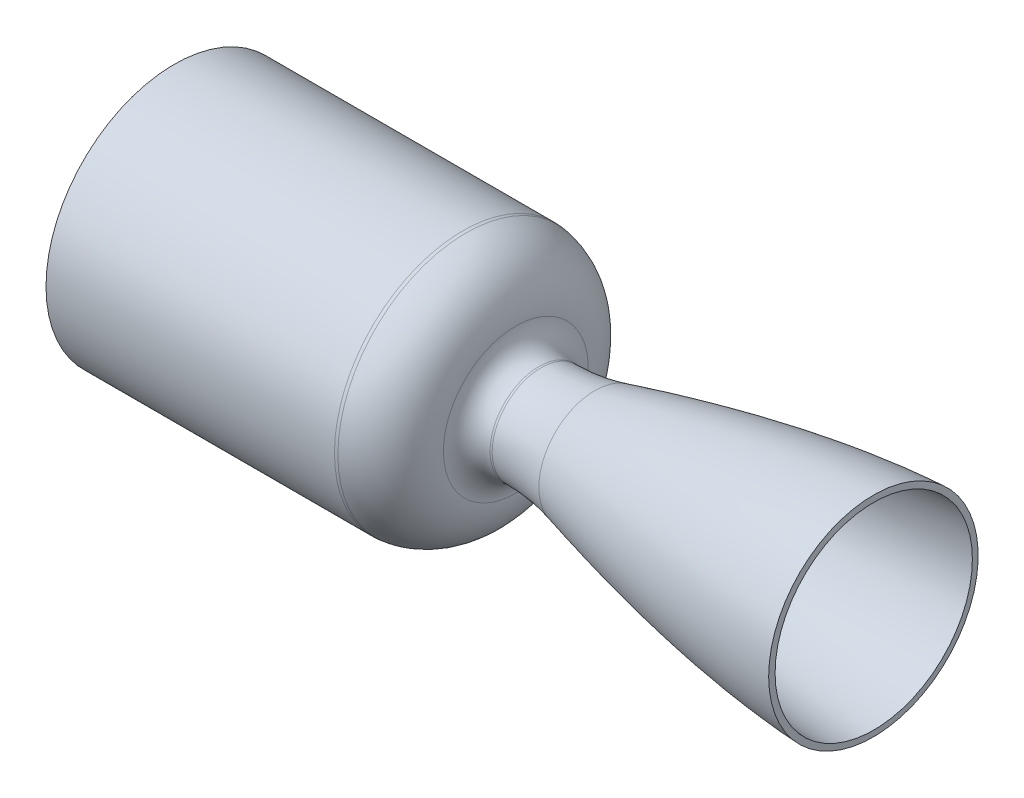
ISO-10303-21;
HEADER;
FILE_DESCRIPTION(('STEP AP214'),'2;1');
FILE_NAME('part.step','',(''),(''),'','','');
FILE_SCHEMA(('AUTOMOTIVE_DESIGN { 1 0 10303 214 1 1 1 1 }'));
ENDSEC;
DATA;
#1=APPLICATION_CONTEXT('core data for automotive mechanical design processes');
#2=APPLICATION_PROTOCOL_DEFINITION('international standard','automotive_design',2000,#1);
#3=PRODUCT_CONTEXT('',#1,'mechanical');
#4=PRODUCT('Part','Part','',(#3));
#5=PRODUCT_RELATED_PRODUCT_CATEGORY('part','',(#4));
#6=PRODUCT_DEFINITION_FORMATION('','',#4);
#7=PRODUCT_DEFINITION_CONTEXT('part definition',#1,'design');
#8=PRODUCT_DEFINITION('design','',#6,#7);
#9=PRODUCT_DEFINITION_SHAPE('','',#8);
#10=(LENGTH_UNIT() NAMED_UNIT(*) SI_UNIT(.MILLI.,.METRE.));
#11=(NAMED_UNIT(*) PLANE_ANGLE_UNIT() SI_UNIT($,.RADIAN.));
#12=(NAMED_UNIT(*) SI_UNIT($,.STERADIAN.) SOLID_ANGLE_UNIT());
#13=UNCERTAINTY_MEASURE_WITH_UNIT(LENGTH_MEASURE(1.E-05),#10,'distance_accuracy_value','');
#14=(GEOMETRIC_REPRESENTATION_CONTEXT(3) GLOBAL_UNCERTAINTY_ASSIGNED_CONTEXT((#13)) GLOBAL_UNIT_ASSIGNED_CONTEXT((#10,
#11,#12)) REPRESENTATION_CONTEXT('',''));
#15=CARTESIAN_POINT('',(0.,0.,0.));
#16=DIRECTION('',(0.,0.,1.));
#17=DIRECTION('',(1.,0.,0.));
#18=AXIS2_PLACEMENT_3D('',#15,#16,#17);
#19=CARTESIAN_POINT('',(-739471.560983386,-672865.723159545,0.));
#20=CARTESIAN_POINT('',(730979.861955402,682847.713899087,0.));
#21=CARTESIAN_POINT('',(-720830.549221071,-692809.525620858,0.));
#22=B_SPLINE_CURVE_WITH_KNOTS('',2,(#19,#20,#21),.UNSPECIFIED.,.F.,.F.,(3,3),(0.,1.),.UNSPECIFIED.);
#23=CARTESIAN_POINT('',(0.,0.,0.));
#24=DIRECTION('',(-1.,0.,0.));
#25=AXIS1_PLACEMENT('',#23,#24);
#26=SURFACE_OF_REVOLUTION('',#22,#25);
#27=CARTESIAN_POINT('',(290.67000002701,0.,0.));
#28=DIRECTION('',(-1.,0.,0.));
#29=DIRECTION('',(0.,0.,1.));
#30=AXIS2_PLACEMENT_3D('',#27,#28,#29);
#31=CIRCLE('',#30,41.0000000013681);
#32=CARTESIAN_POINT('',(290.67000002701,0.,41.0000000013681));
#33=VERTEX_POINT('',#32);
#34=EDGE_CURVE('E73',#33,#33,#31,.T.);
#35=ORIENTED_EDGE('',*,*,#34,.F.);
#36=EDGE_LOOP('',(#35));
#37=FACE_BOUND('',#36,.T.);
#38=CARTESIAN_POINT('',(175.409013109655,0.,0.));
#39=DIRECTION('',(-1.,0.,0.));
#40=DIRECTION('',(0.,0.,1.));
#41=AXIS2_PLACEMENT_3D('',#38,#39,#40);
#42=CIRCLE('',#41,20.8091940429087);
#43=CARTESIAN_POINT('',(175.409013109655,0.,20.8091940429087));
#44=VERTEX_POINT('',#43);
#45=EDGE_CURVE('E94',#44,#44,#42,.T.);
#46=ORIENTED_EDGE('',*,*,#45,.T.);
#47=EDGE_LOOP('',(#46));
#48=FACE_BOUND('',#47,.T.);
#49=ADVANCED_FACE('F41',(#37,#48),#26,.T.);
#50=CARTESIAN_POINT('',(290.537066698398,0.,0.));
#51=DIRECTION('',(-1.,0.,0.));
#52=DIRECTION('',(0.,0.,1.));
#53=AXIS2_PLACEMENT_3D('',#50,#51,#52);
#54=CONICAL_SURFACE('',#53,43.5365190196446,1.51843644933143);
#55=ORIENTED_EDGE('',*,*,#34,.T.);
#56=EDGE_LOOP('',(#55));
#57=FACE_BOUND('',#56,.T.);
#58=CARTESIAN_POINT('',(290.537066698398,0.,0.));
#59=DIRECTION('',(-1.,0.,0.));
#60=DIRECTION('',(0.,0.,1.));
#61=AXIS2_PLACEMENT_3D('',#58,#59,#60);
#62=CIRCLE('',#61,43.5365190196446);
#63=CARTESIAN_POINT('',(290.537066698398,0.,43.5365190196446));
#64=VERTEX_POINT('',#63);
#65=EDGE_CURVE('E76',#64,#64,#62,.T.);
#66=ORIENTED_EDGE('',*,*,#65,.F.);
#67=EDGE_LOOP('',(#66));
#68=FACE_BOUND('',#67,.T.);
#69=ADVANCED_FACE('F113',(#57,#68),#54,.T.);
#70=CARTESIAN_POINT('',(174.75161273509,23.2626456416472,0.));
#71=CARTESIAN_POINT('',(218.642379212097,35.0231410743445,0.));
#72=CARTESIAN_POINT('',(257.222392683807,41.7905709395863,0.));
#73=CARTESIAN_POINT('',(290.537066698398,43.5365190196446,0.));
#74=B_SPLINE_CURVE_WITH_KNOTS('',3,(#70,#71,#72,#73),.UNSPECIFIED.,.F.,.F.,(4,4),(0.,1.),.UNSPECIFIED.);
#75=CARTESIAN_POINT('',(0.,0.,0.));
#76=DIRECTION('',(-1.,0.,0.));
#77=AXIS1_PLACEMENT('',#75,#76);
#78=SURFACE_OF_REVOLUTION('',#74,#77);
#79=ORIENTED_EDGE('',*,*,#65,.T.);
#80=EDGE_LOOP('',(#79));
#81=FACE_BOUND('',#80,.T.);
#82=CARTESIAN_POINT('',(174.751612735093,0.,0.));
#83=DIRECTION('',(-1.,0.,0.));
#84=DIRECTION('',(0.,0.,1.));
#85=AXIS2_PLACEMENT_3D('',#82,#83,#84);
#86=CIRCLE('',#85,23.2626456416826);
#87=CARTESIAN_POINT('',(174.751612735093,0.,23.2626456416826));
#88=VERTEX_POINT('',#87);
#89=EDGE_CURVE('E79',#88,#88,#86,.T.);
#90=ORIENTED_EDGE('',*,*,#89,.F.);
#91=EDGE_LOOP('',(#90));
#92=FACE_BOUND('',#91,.T.);
#93=ADVANCED_FACE('F108',(#81,#92),#78,.F.);
#94=CARTESIAN_POINT('',(152.4,0.,0.));
#95=DIRECTION('',(-1.,0.,0.));
#96=DIRECTION('',(0.,0.,1.));
#97=AXIS2_PLACEMENT_3D('',#94,#95,#96);
#98=TOROIDAL_SURFACE('',#97,106.68,86.3600000000039);
#99=ORIENTED_EDGE('',*,*,#89,.T.);
#100=EDGE_LOOP('',(#99));
#101=FACE_BOUND('',#100,.T.);
#102=CARTESIAN_POINT('',(152.4,0.,0.));
#103=DIRECTION('',(-1.,0.,0.));
#104=DIRECTION('',(0.,0.,1.));
#105=AXIS2_PLACEMENT_3D('',#102,#103,#104);
#106=CIRCLE('',#105,20.3199999999961);
#107=CARTESIAN_POINT('',(152.4,0.,20.3199999999961));
#108=VERTEX_POINT('',#107);
#109=EDGE_CURVE('E82',#108,#108,#106,.T.);
#110=ORIENTED_EDGE('',*,*,#109,.F.);
#111=EDGE_LOOP('',(#110));
#112=FACE_BOUND('',#111,.T.);
#113=ADVANCED_FACE('F112',(#101,#112),#98,.F.);
#114=CARTESIAN_POINT('',(152.4,0.,0.));
#115=DIRECTION('',(-1.,0.,0.));
#116=DIRECTION('',(0.,0.,1.));
#117=AXIS2_PLACEMENT_3D('',#114,#115,#116);
#118=TOROIDAL_SURFACE('',#117,42.67,22.35);
#119=CARTESIAN_POINT('',(151.543239185923,0.,0.));
#120=DIRECTION('',(1.,0.,0.));
#121=DIRECTION('',(0.,0.,-1.));
#122=AXIS2_PLACEMENT_3D('',#119,#120,#121);
#123=CIRCLE('',#122,20.3364274934022);
#124=CARTESIAN_POINT('',(151.543239185923,0.,-20.3364274934022));
#125=VERTEX_POINT('',#124);
#126=EDGE_CURVE('E61',#125,#125,#123,.T.);
#127=ORIENTED_EDGE('',*,*,#126,.T.);
#128=EDGE_LOOP('',(#127));
#129=FACE_BOUND('',#128,.T.);
#130=ORIENTED_EDGE('',*,*,#109,.T.);
#131=EDGE_LOOP('',(#130));
#132=FACE_BOUND('',#131,.T.);
#133=ADVANCED_FACE('F166',(#129,#132),#118,.F.);
#134=CARTESIAN_POINT('',(118.015626081095,0.,0.));
#135=DIRECTION('',(-1.,0.,0.));
#136=DIRECTION('',(0.,0.,1.));
#137=AXIS2_PLACEMENT_3D('',#134,#135,#136);
#138=TOROIDAL_SURFACE('',#137,29.5456340164311,23.92);
#139=CARTESIAN_POINT('',(121.222102393642,0.,0.));
#140=DIRECTION('',(-1.,0.,0.));
#141=DIRECTION('',(0.,0.,1.));
#142=AXIS2_PLACEMENT_3D('',#139,#140,#141);
#143=CIRCLE('',#142,53.2497456778512);
#144=CARTESIAN_POINT('',(121.222102393642,0.,53.2497456778512));
#145=VERTEX_POINT('',#144);
#146=EDGE_CURVE('E64',#145,#145,#143,.F.);
#147=ORIENTED_EDGE('',*,*,#146,.T.);
#148=EDGE_LOOP('',(#147));
#149=FACE_BOUND('',#148,.T.);
#150=CARTESIAN_POINT('',(141.929245023845,0.,0.));
#151=DIRECTION('',(-1.,0.,0.));
#152=DIRECTION('',(0.,0.,1.));
#153=AXIS2_PLACEMENT_3D('',#150,#151,#152);
#154=CIRCLE('',#153,30.0981094104213);
#155=CARTESIAN_POINT('',(141.929245023845,0.,30.0981094104213));
#156=VERTEX_POINT('',#155);
#157=EDGE_CURVE('E67',#156,#156,#154,.T.);
#158=ORIENTED_EDGE('',*,*,#157,.T.);
#159=EDGE_LOOP('',(#158));
#160=FACE_BOUND('',#159,.T.);
#161=ADVANCED_FACE('F163',(#149,#160),#138,.T.);
#162=CARTESIAN_POINT('',(0.,0.,0.));
#163=DIRECTION('',(-1.,0.,0.));
#164=DIRECTION('',(0.,0.,1.));
#165=AXIS2_PLACEMENT_3D('',#162,#163,#164);
#166=CYLINDRICAL_SURFACE('',#165,53.34);
#167=CARTESIAN_POINT('',(119.881602262978,0.,0.));
#168=DIRECTION('',(1.,0.,0.));
#169=DIRECTION('',(0.,0.,-1.));
#170=AXIS2_PLACEMENT_3D('',#167,#168,#169);
#171=CIRCLE('',#170,53.34);
#172=CARTESIAN_POINT('',(119.881602262978,0.,-53.34));
#173=VERTEX_POINT('',#172);
#174=EDGE_CURVE('E70',#173,#173,#171,.F.);
#175=ORIENTED_EDGE('',*,*,#174,.T.);
#176=EDGE_LOOP('',(#175));
#177=FACE_BOUND('',#176,.T.);
#178=CARTESIAN_POINT('',(0.,0.,0.));
#179=DIRECTION('',(-1.,0.,0.));
#180=DIRECTION('',(0.,0.,1.));
#181=AXIS2_PLACEMENT_3D('',#178,#179,#180);
#182=CIRCLE('',#181,53.34);
#183=CARTESIAN_POINT('',(0.,0.,53.34));
#184=VERTEX_POINT('',#183);
#185=EDGE_CURVE('E85',#184,#184,#182,.T.);
#186=ORIENTED_EDGE('',*,*,#185,.F.);
#187=EDGE_LOOP('',(#186));
#188=FACE_BOUND('',#187,.T.);
#189=ADVANCED_FACE('F159',(#177,#188),#166,.T.);
#190=CARTESIAN_POINT('',(0.,50.8,0.));
#191=DIRECTION('',(-1.,0.,0.));
#192=DIRECTION('',(0.,0.,1.));
#193=AXIS2_PLACEMENT_3D('',#190,#191,#192);
#194=PLANE('',#193);
#195=ORIENTED_EDGE('',*,*,#185,.T.);
#196=EDGE_LOOP('',(#195));
#197=FACE_BOUND('',#196,.T.);
#198=CARTESIAN_POINT('',(0.,0.,0.));
#199=DIRECTION('',(-1.,0.,0.));
#200=DIRECTION('',(0.,0.,1.));
#201=AXIS2_PLACEMENT_3D('',#198,#199,#200);
#202=CIRCLE('',#201,50.8);
#203=CARTESIAN_POINT('',(0.,0.,50.8));
#204=VERTEX_POINT('',#203);
#205=EDGE_CURVE('E88',#204,#204,#202,.T.);
#206=ORIENTED_EDGE('',*,*,#205,.F.);
#207=EDGE_LOOP('',(#206));
#208=FACE_BOUND('',#207,.T.);
#209=ADVANCED_FACE('F153',(#197,#208),#194,.T.);
#210=CARTESIAN_POINT('',(0.,0.,0.));
#211=DIRECTION('',(-1.,0.,0.));
#212=DIRECTION('',(0.,0.,1.));
#213=AXIS2_PLACEMENT_3D('',#210,#211,#212);
#214=CYLINDRICAL_SURFACE('',#213,50.8);
#215=CARTESIAN_POINT('',(119.701937531535,0.,0.));
#216=DIRECTION('',(-1.,0.,0.));
#217=DIRECTION('',(0.,0.,1.));
#218=AXIS2_PLACEMENT_3D('',#215,#216,#217);
#219=CIRCLE('',#218,50.8);
#220=CARTESIAN_POINT('',(119.701937531535,0.,50.8));
#221=VERTEX_POINT('',#220);
#222=EDGE_CURVE('E48',#221,#221,#219,.F.);
#223=ORIENTED_EDGE('',*,*,#222,.T.);
#224=EDGE_LOOP('',(#223));
#225=FACE_BOUND('',#224,.T.);
#226=ORIENTED_EDGE('',*,*,#205,.T.);
#227=EDGE_LOOP('',(#226));
#228=FACE_BOUND('',#227,.T.);
#229=ADVANCED_FACE('F145',(#225,#228),#214,.F.);
#230=CARTESIAN_POINT('',(118.015626081095,0.,0.));
#231=DIRECTION('',(-1.,0.,0.));
#232=DIRECTION('',(0.,0.,1.));
#233=AXIS2_PLACEMENT_3D('',#230,#231,#232);
#234=TOROIDAL_SURFACE('',#233,29.5456340164311,21.38);
#235=CARTESIAN_POINT('',(121.183757786756,0.,0.));
#236=DIRECTION('',(-1.,0.,0.));
#237=DIRECTION('',(0.,0.,1.));
#238=AXIS2_PLACEMENT_3D('',#235,#236,#237);
#239=CIRCLE('',#238,50.6896010400429);
#240=CARTESIAN_POINT('',(121.183757786756,0.,50.6896010400429));
#241=VERTEX_POINT('',#240);
#242=EDGE_CURVE('E52',#241,#241,#239,.T.);
#243=ORIENTED_EDGE('',*,*,#242,.T.);
#244=EDGE_LOOP('',(#243));
#245=FACE_BOUND('',#244,.T.);
#246=CARTESIAN_POINT('',(139.372712772034,0.,0.));
#247=DIRECTION('',(-1.,0.,0.));
#248=DIRECTION('',(0.,0.,1.));
#249=AXIS2_PLACEMENT_3D('',#246,#247,#248);
#250=CIRCLE('',#249,28.5560643747716);
#251=CARTESIAN_POINT('',(139.372712772034,0.,28.5560643747716));
#252=VERTEX_POINT('',#251);
#253=EDGE_CURVE('E56',#252,#252,#250,.F.);
#254=ORIENTED_EDGE('',*,*,#253,.T.);
#255=EDGE_LOOP('',(#254));
#256=FACE_BOUND('',#255,.T.);
#257=ADVANCED_FACE('F141',(#245,#256),#234,.F.);
#258=CARTESIAN_POINT('',(152.4,0.,0.));
#259=DIRECTION('',(-1.,0.,0.));
#260=DIRECTION('',(0.,0.,1.));
#261=AXIS2_PLACEMENT_3D('',#258,#259,#260);
#262=TOROIDAL_SURFACE('',#261,42.67,24.89);
#263=CARTESIAN_POINT('',(147.321697148373,0.,0.));
#264=DIRECTION('',(1.,0.,0.));
#265=DIRECTION('',(0.,0.,-1.));
#266=AXIS2_PLACEMENT_3D('',#263,#264,#265);
#267=CIRCLE('',#266,18.3035694007686);
#268=CARTESIAN_POINT('',(147.321697148373,0.,-18.3035694007686));
#269=VERTEX_POINT('',#268);
#270=EDGE_CURVE('E10',#269,#269,#267,.F.);
#271=ORIENTED_EDGE('',*,*,#270,.T.);
#272=EDGE_LOOP('',(#271));
#273=FACE_BOUND('',#272,.T.);
#274=CARTESIAN_POINT('',(152.4,0.,0.));
#275=DIRECTION('',(-1.,0.,0.));
#276=DIRECTION('',(0.,0.,1.));
#277=AXIS2_PLACEMENT_3D('',#274,#275,#276);
#278=CIRCLE('',#277,17.78);
#279=CARTESIAN_POINT('',(152.4,0.,17.78));
#280=VERTEX_POINT('',#279);
#281=EDGE_CURVE('E91',#280,#280,#278,.T.);
#282=ORIENTED_EDGE('',*,*,#281,.F.);
#283=EDGE_LOOP('',(#282));
#284=FACE_BOUND('',#283,.T.);
#285=ADVANCED_FACE('F144',(#273,#284),#262,.T.);
#286=CARTESIAN_POINT('',(152.4,0.,0.));
#287=DIRECTION('',(-1.,0.,0.));
#288=DIRECTION('',(0.,0.,1.));
#289=AXIS2_PLACEMENT_3D('',#286,#287,#288);
#290=TOROIDAL_SURFACE('',#289,106.68,88.9000000000039);
#291=ORIENTED_EDGE('',*,*,#45,.F.);
#292=EDGE_LOOP('',(#291));
#293=FACE_BOUND('',#292,.T.);
#294=ORIENTED_EDGE('',*,*,#281,.T.);
#295=EDGE_LOOP('',(#294));
#296=FACE_BOUND('',#295,.T.);
#297=ADVANCED_FACE('F126',(#293,#296),#290,.T.);
#298=CARTESIAN_POINT('',(119.881602262978,0.,0.));
#299=DIRECTION('',(1.,0.,0.));
#300=DIRECTION('',(0.,0.,-1.));
#301=AXIS2_PLACEMENT_3D('',#298,#299,#300);
#302=TOROIDAL_SURFACE('',#301,43.34,10.);
#303=ORIENTED_EDGE('',*,*,#146,.F.);
#304=EDGE_LOOP('',(#303));
#305=FACE_BOUND('',#304,.T.);
#306=ORIENTED_EDGE('',*,*,#174,.F.);
#307=EDGE_LOOP('',(#306));
#308=FACE_BOUND('',#307,.T.);
#309=ADVANCED_FACE('F122',(#305,#308),#302,.T.);
#310=CARTESIAN_POINT('',(151.92657735777,0.,0.));
#311=DIRECTION('',(-1.,0.,0.));
#312=DIRECTION('',(0.,0.,1.));
#313=AXIS2_PLACEMENT_3D('',#310,#311,#312);
#314=TOROIDAL_SURFACE('',#313,30.3290773844974,10.);
#315=ORIENTED_EDGE('',*,*,#126,.F.);
#316=EDGE_LOOP('',(#315));
#317=FACE_BOUND('',#316,.T.);
#318=ORIENTED_EDGE('',*,*,#157,.F.);
#319=EDGE_LOOP('',(#318));
#320=FACE_BOUND('',#319,.T.);
#321=ADVANCED_FACE('F125',(#317,#320),#314,.F.);
#322=CARTESIAN_POINT('',(119.701937531535,0.,0.));
#323=DIRECTION('',(-1.,0.,0.));
#324=DIRECTION('',(0.,0.,1.));
#325=AXIS2_PLACEMENT_3D('',#322,#323,#324);
#326=TOROIDAL_SURFACE('',#325,40.8,10.);
#327=ORIENTED_EDGE('',*,*,#222,.F.);
#328=EDGE_LOOP('',(#327));
#329=FACE_BOUND('',#328,.T.);
#330=ORIENTED_EDGE('',*,*,#242,.F.);
#331=EDGE_LOOP('',(#330));
#332=FACE_BOUND('',#331,.T.);
#333=ADVANCED_FACE('F129',(#329,#332),#326,.F.);
#334=CARTESIAN_POINT('',(149.361995602221,0.,0.));
#335=DIRECTION('',(1.,0.,0.));
#336=DIRECTION('',(0.,0.,-1.));
#337=AXIS2_PLACEMENT_3D('',#334,#335,#336);
#338=TOROIDAL_SURFACE('',#337,28.0932160858756,10.);
#339=ORIENTED_EDGE('',*,*,#253,.F.);
#340=EDGE_LOOP('',(#339));
#341=FACE_BOUND('',#340,.T.);
#342=ORIENTED_EDGE('',*,*,#270,.F.);
#343=EDGE_LOOP('',(#342));
#344=FACE_BOUND('',#343,.T.);
#345=ADVANCED_FACE('F43',(#341,#344),#338,.T.);
#346=CLOSED_SHELL('',(#49,#69,#93,#113,#133,#161,#189,#209,#229,#257,#285,#297,#309,#321,#333,#345));
#347=MANIFOLD_SOLID_BREP('B2',#346);
#348=ADVANCED_BREP_SHAPE_REPRESENTATION('',(#18,#347),#14);
#349=SHAPE_DEFINITION_REPRESENTATION(#9,#348);
ENDSEC;
END-ISO-10303-21;
